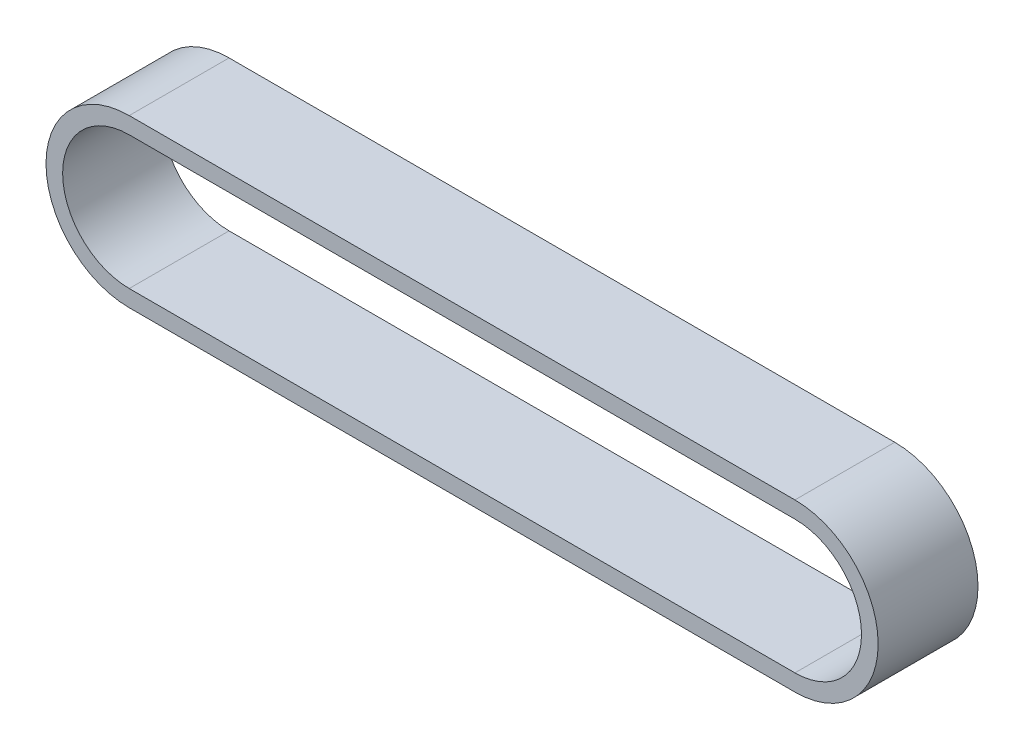
ISO-10303-21;
HEADER;
FILE_DESCRIPTION(('STEP AP214'),'2;1');
FILE_NAME('part.step','',(''),(''),'','','');
FILE_SCHEMA(('AUTOMOTIVE_DESIGN { 1 0 10303 214 1 1 1 1 }'));
ENDSEC;
DATA;
#1=APPLICATION_CONTEXT('core data for automotive mechanical design processes');
#2=APPLICATION_PROTOCOL_DEFINITION('international standard','automotive_design',2000,#1);
#3=PRODUCT_CONTEXT('',#1,'mechanical');
#4=PRODUCT('Part','Part','',(#3));
#5=PRODUCT_RELATED_PRODUCT_CATEGORY('part','',(#4));
#6=PRODUCT_DEFINITION_FORMATION('','',#4);
#7=PRODUCT_DEFINITION_CONTEXT('part definition',#1,'design');
#8=PRODUCT_DEFINITION('design','',#6,#7);
#9=PRODUCT_DEFINITION_SHAPE('','',#8);
#10=(LENGTH_UNIT() NAMED_UNIT(*) SI_UNIT(.MILLI.,.METRE.));
#11=(NAMED_UNIT(*) PLANE_ANGLE_UNIT() SI_UNIT($,.RADIAN.));
#12=(NAMED_UNIT(*) SI_UNIT($,.STERADIAN.) SOLID_ANGLE_UNIT());
#13=UNCERTAINTY_MEASURE_WITH_UNIT(LENGTH_MEASURE(1.E-05),#10,'distance_accuracy_value','');
#14=(GEOMETRIC_REPRESENTATION_CONTEXT(3) GLOBAL_UNCERTAINTY_ASSIGNED_CONTEXT((#13)) GLOBAL_UNIT_ASSIGNED_CONTEXT((#10,
#11,#12)) REPRESENTATION_CONTEXT('',''));
#15=CARTESIAN_POINT('',(0.,0.,0.));
#16=DIRECTION('',(0.,0.,1.));
#17=DIRECTION('',(1.,0.,0.));
#18=AXIS2_PLACEMENT_3D('',#15,#16,#17);
#19=CARTESIAN_POINT('',(0.588618423098236,58.840344830129,15.24));
#20=DIRECTION('',(0.,0.,1.));
#21=DIRECTION('',(1.,0.,0.));
#22=AXIS2_PLACEMENT_3D('',#19,#20,#21);
#23=PLANE('',#22);
#24=CARTESIAN_POINT('',(0.588618423098236,58.840344830129,15.24));
#25=DIRECTION('',(0.,0.,1.));
#26=DIRECTION('',(1.,0.,0.));
#27=AXIS2_PLACEMENT_3D('',#24,#25,#26);
#28=CIRCLE('',#27,12.7);
#29=CARTESIAN_POINT('',(0.588618423098236,71.540344830129,15.24));
#30=VERTEX_POINT('',#29);
#31=CARTESIAN_POINT('',(0.588618423098236,46.140344830129,15.24));
#32=VERTEX_POINT('',#31);
#33=EDGE_CURVE('E133',#30,#32,#28,.T.);
#34=ORIENTED_EDGE('',*,*,#33,.T.);
#35=DIRECTION('',(1.,0.,0.));
#36=VECTOR('',#35,1.);
#37=CARTESIAN_POINT('',(0.588618423098236,46.140344830129,15.24));
#38=LINE('',#37,#36);
#39=CARTESIAN_POINT('',(102.188618423098,46.140344830129,15.24));
#40=VERTEX_POINT('',#39);
#41=EDGE_CURVE('E136',#32,#40,#38,.T.);
#42=ORIENTED_EDGE('',*,*,#41,.T.);
#43=CARTESIAN_POINT('',(102.188618423098,58.840344830129,15.24));
#44=DIRECTION('',(0.,0.,1.));
#45=DIRECTION('',(1.,0.,0.));
#46=AXIS2_PLACEMENT_3D('',#43,#44,#45);
#47=CIRCLE('',#46,12.7);
#48=CARTESIAN_POINT('',(102.188618423098,71.540344830129,15.24));
#49=VERTEX_POINT('',#48);
#50=EDGE_CURVE('E139',#40,#49,#47,.T.);
#51=ORIENTED_EDGE('',*,*,#50,.T.);
#52=DIRECTION('',(-1.,0.,0.));
#53=VECTOR('',#52,1.);
#54=CARTESIAN_POINT('',(0.588618423098236,71.540344830129,15.24));
#55=LINE('',#54,#53);
#56=EDGE_CURVE('E141',#49,#30,#55,.T.);
#57=ORIENTED_EDGE('',*,*,#56,.T.);
#58=EDGE_LOOP('',(#34,#42,#51,#57));
#59=FACE_BOUND('',#58,.T.);
#60=DIRECTION('',(1.,0.,0.));
#61=VECTOR('',#60,1.);
#62=CARTESIAN_POINT('',(0.588618423098236,48.680344830129,15.24));
#63=LINE('',#62,#61);
#64=CARTESIAN_POINT('',(0.588618423098236,48.680344830129,15.24));
#65=VERTEX_POINT('',#64);
#66=CARTESIAN_POINT('',(102.188618423098,48.680344830129,15.24));
#67=VERTEX_POINT('',#66);
#68=EDGE_CURVE('E105',#65,#67,#63,.T.);
#69=ORIENTED_EDGE('',*,*,#68,.F.);
#70=CARTESIAN_POINT('',(0.588618423098236,58.840344830129,15.24));
#71=DIRECTION('',(0.,0.,1.));
#72=DIRECTION('',(1.,0.,0.));
#73=AXIS2_PLACEMENT_3D('',#70,#71,#72);
#74=CIRCLE('',#73,10.16);
#75=CARTESIAN_POINT('',(0.588618423098236,69.000344830129,15.24));
#76=VERTEX_POINT('',#75);
#77=EDGE_CURVE('E97',#76,#65,#74,.T.);
#78=ORIENTED_EDGE('',*,*,#77,.F.);
#79=DIRECTION('',(-1.,0.,0.));
#80=VECTOR('',#79,1.);
#81=CARTESIAN_POINT('',(0.588618423098236,69.000344830129,15.24));
#82=LINE('',#81,#80);
#83=CARTESIAN_POINT('',(102.188618423098,69.000344830129,15.24));
#84=VERTEX_POINT('',#83);
#85=EDGE_CURVE('E119',#84,#76,#82,.T.);
#86=ORIENTED_EDGE('',*,*,#85,.F.);
#87=CARTESIAN_POINT('',(102.188618423098,58.840344830129,15.24));
#88=DIRECTION('',(0.,0.,1.));
#89=DIRECTION('',(1.,0.,0.));
#90=AXIS2_PLACEMENT_3D('',#87,#88,#89);
#91=CIRCLE('',#90,10.16);
#92=EDGE_CURVE('E117',#67,#84,#91,.T.);
#93=ORIENTED_EDGE('',*,*,#92,.F.);
#94=EDGE_LOOP('',(#69,#78,#86,#93));
#95=FACE_BOUND('',#94,.T.);
#96=ADVANCED_FACE('F32',(#59,#95),#23,.T.);
#97=CARTESIAN_POINT('',(0.588618423098236,58.840344830129,0.));
#98=DIRECTION('',(0.,0.,1.));
#99=DIRECTION('',(1.,0.,0.));
#100=AXIS2_PLACEMENT_3D('',#97,#98,#99);
#101=PLANE('',#100);
#102=CARTESIAN_POINT('',(0.588618423098236,58.840344830129,0.));
#103=DIRECTION('',(0.,0.,1.));
#104=DIRECTION('',(1.,0.,0.));
#105=AXIS2_PLACEMENT_3D('',#102,#103,#104);
#106=CIRCLE('',#105,12.7);
#107=CARTESIAN_POINT('',(0.588618423098236,71.540344830129,0.));
#108=VERTEX_POINT('',#107);
#109=CARTESIAN_POINT('',(0.588618423098236,46.140344830129,0.));
#110=VERTEX_POINT('',#109);
#111=EDGE_CURVE('E113',#108,#110,#106,.T.);
#112=ORIENTED_EDGE('',*,*,#111,.F.);
#113=DIRECTION('',(-1.,0.,0.));
#114=VECTOR('',#113,1.);
#115=CARTESIAN_POINT('',(0.588618423098236,71.540344830129,0.));
#116=LINE('',#115,#114);
#117=CARTESIAN_POINT('',(102.188618423098,71.540344830129,0.));
#118=VERTEX_POINT('',#117);
#119=EDGE_CURVE('E137',#118,#108,#116,.T.);
#120=ORIENTED_EDGE('',*,*,#119,.F.);
#121=CARTESIAN_POINT('',(102.188618423098,58.840344830129,0.));
#122=DIRECTION('',(0.,0.,1.));
#123=DIRECTION('',(1.,0.,0.));
#124=AXIS2_PLACEMENT_3D('',#121,#122,#123);
#125=CIRCLE('',#124,12.7);
#126=CARTESIAN_POINT('',(102.188618423098,46.140344830129,0.));
#127=VERTEX_POINT('',#126);
#128=EDGE_CURVE('E148',#127,#118,#125,.T.);
#129=ORIENTED_EDGE('',*,*,#128,.F.);
#130=DIRECTION('',(1.,0.,0.));
#131=VECTOR('',#130,1.);
#132=CARTESIAN_POINT('',(0.588618423098236,46.140344830129,0.));
#133=LINE('',#132,#131);
#134=EDGE_CURVE('E146',#110,#127,#133,.T.);
#135=ORIENTED_EDGE('',*,*,#134,.F.);
#136=EDGE_LOOP('',(#112,#120,#129,#135));
#137=FACE_BOUND('',#136,.T.);
#138=CARTESIAN_POINT('',(0.588618423098236,58.840344830129,0.));
#139=DIRECTION('',(0.,0.,1.));
#140=DIRECTION('',(1.,0.,0.));
#141=AXIS2_PLACEMENT_3D('',#138,#139,#140);
#142=CIRCLE('',#141,10.16);
#143=CARTESIAN_POINT('',(0.588618423098236,69.000344830129,0.));
#144=VERTEX_POINT('',#143);
#145=CARTESIAN_POINT('',(0.588618423098236,48.680344830129,0.));
#146=VERTEX_POINT('',#145);
#147=EDGE_CURVE('E55',#144,#146,#142,.T.);
#148=ORIENTED_EDGE('',*,*,#147,.T.);
#149=DIRECTION('',(1.,0.,0.));
#150=VECTOR('',#149,1.);
#151=CARTESIAN_POINT('',(0.588618423098236,48.680344830129,0.));
#152=LINE('',#151,#150);
#153=CARTESIAN_POINT('',(102.188618423098,48.680344830129,0.));
#154=VERTEX_POINT('',#153);
#155=EDGE_CURVE('E112',#146,#154,#152,.T.);
#156=ORIENTED_EDGE('',*,*,#155,.T.);
#157=CARTESIAN_POINT('',(102.188618423098,58.840344830129,0.));
#158=DIRECTION('',(0.,0.,1.));
#159=DIRECTION('',(1.,0.,0.));
#160=AXIS2_PLACEMENT_3D('',#157,#158,#159);
#161=CIRCLE('',#160,10.16);
#162=CARTESIAN_POINT('',(102.188618423098,69.000344830129,0.));
#163=VERTEX_POINT('',#162);
#164=EDGE_CURVE('E125',#154,#163,#161,.T.);
#165=ORIENTED_EDGE('',*,*,#164,.T.);
#166=DIRECTION('',(-1.,0.,0.));
#167=VECTOR('',#166,1.);
#168=CARTESIAN_POINT('',(0.588618423098236,69.000344830129,0.));
#169=LINE('',#168,#167);
#170=EDGE_CURVE('E106',#163,#144,#169,.T.);
#171=ORIENTED_EDGE('',*,*,#170,.T.);
#172=EDGE_LOOP('',(#148,#156,#165,#171));
#173=FACE_BOUND('',#172,.T.);
#174=ADVANCED_FACE('F166',(#137,#173),#101,.F.);
#175=CARTESIAN_POINT('',(0.588618423098236,58.840344830129,15.24));
#176=DIRECTION('',(0.,0.,-1.));
#177=DIRECTION('',(-1.,0.,0.));
#178=AXIS2_PLACEMENT_3D('',#175,#176,#177);
#179=CYLINDRICAL_SURFACE('',#178,12.7);
#180=ORIENTED_EDGE('',*,*,#111,.T.);
#181=DIRECTION('',(0.,0.,-1.));
#182=VECTOR('',#181,1.);
#183=CARTESIAN_POINT('',(0.588618423098236,46.140344830129,15.24));
#184=LINE('',#183,#182);
#185=EDGE_CURVE('E11',#32,#110,#184,.T.);
#186=ORIENTED_EDGE('',*,*,#185,.F.);
#187=ORIENTED_EDGE('',*,*,#33,.F.);
#188=DIRECTION('',(0.,0.,-1.));
#189=VECTOR('',#188,1.);
#190=CARTESIAN_POINT('',(0.588618423098236,71.540344830129,15.24));
#191=LINE('',#190,#189);
#192=EDGE_CURVE('E143',#30,#108,#191,.T.);
#193=ORIENTED_EDGE('',*,*,#192,.T.);
#194=EDGE_LOOP('',(#180,#186,#187,#193));
#195=FACE_BOUND('',#194,.T.);
#196=ADVANCED_FACE('F34',(#195),#179,.T.);
#197=CARTESIAN_POINT('',(0.588618423098236,46.140344830129,15.24));
#198=DIRECTION('',(0.,1.,0.));
#199=DIRECTION('',(0.,0.,1.));
#200=AXIS2_PLACEMENT_3D('',#197,#198,#199);
#201=PLANE('',#200);
#202=ORIENTED_EDGE('',*,*,#134,.T.);
#203=DIRECTION('',(0.,0.,-1.));
#204=VECTOR('',#203,1.);
#205=CARTESIAN_POINT('',(102.188618423098,46.140344830129,15.24));
#206=LINE('',#205,#204);
#207=EDGE_CURVE('E40',#40,#127,#206,.T.);
#208=ORIENTED_EDGE('',*,*,#207,.F.);
#209=ORIENTED_EDGE('',*,*,#41,.F.);
#210=ORIENTED_EDGE('',*,*,#185,.T.);
#211=EDGE_LOOP('',(#202,#208,#209,#210));
#212=FACE_BOUND('',#211,.T.);
#213=ADVANCED_FACE('F176',(#212),#201,.F.);
#214=CARTESIAN_POINT('',(102.188618423098,58.840344830129,15.24));
#215=DIRECTION('',(0.,0.,-1.));
#216=DIRECTION('',(-1.,0.,0.));
#217=AXIS2_PLACEMENT_3D('',#214,#215,#216);
#218=CYLINDRICAL_SURFACE('',#217,12.7);
#219=ORIENTED_EDGE('',*,*,#128,.T.);
#220=DIRECTION('',(0.,0.,-1.));
#221=VECTOR('',#220,1.);
#222=CARTESIAN_POINT('',(102.188618423098,71.540344830129,15.24));
#223=LINE('',#222,#221);
#224=EDGE_CURVE('E153',#49,#118,#223,.T.);
#225=ORIENTED_EDGE('',*,*,#224,.F.);
#226=ORIENTED_EDGE('',*,*,#50,.F.);
#227=ORIENTED_EDGE('',*,*,#207,.T.);
#228=EDGE_LOOP('',(#219,#225,#226,#227));
#229=FACE_BOUND('',#228,.T.);
#230=ADVANCED_FACE('F160',(#229),#218,.T.);
#231=CARTESIAN_POINT('',(0.588618423098236,71.540344830129,15.24));
#232=DIRECTION('',(0.,-1.,0.));
#233=DIRECTION('',(0.,0.,-1.));
#234=AXIS2_PLACEMENT_3D('',#231,#232,#233);
#235=PLANE('',#234);
#236=ORIENTED_EDGE('',*,*,#119,.T.);
#237=ORIENTED_EDGE('',*,*,#192,.F.);
#238=ORIENTED_EDGE('',*,*,#56,.F.);
#239=ORIENTED_EDGE('',*,*,#224,.T.);
#240=EDGE_LOOP('',(#236,#237,#238,#239));
#241=FACE_BOUND('',#240,.T.);
#242=ADVANCED_FACE('F170',(#241),#235,.F.);
#243=CARTESIAN_POINT('',(0.588618423098236,58.840344830129,15.24));
#244=DIRECTION('',(0.,0.,-1.));
#245=DIRECTION('',(-1.,0.,0.));
#246=AXIS2_PLACEMENT_3D('',#243,#244,#245);
#247=CYLINDRICAL_SURFACE('',#246,10.16);
#248=ORIENTED_EDGE('',*,*,#147,.F.);
#249=DIRECTION('',(0.,0.,-1.));
#250=VECTOR('',#249,1.);
#251=CARTESIAN_POINT('',(0.588618423098236,69.000344830129,15.24));
#252=LINE('',#251,#250);
#253=EDGE_CURVE('E101',#76,#144,#252,.T.);
#254=ORIENTED_EDGE('',*,*,#253,.F.);
#255=ORIENTED_EDGE('',*,*,#77,.T.);
#256=DIRECTION('',(0.,0.,-1.));
#257=VECTOR('',#256,1.);
#258=CARTESIAN_POINT('',(0.588618423098236,48.680344830129,15.24));
#259=LINE('',#258,#257);
#260=EDGE_CURVE('E100',#65,#146,#259,.T.);
#261=ORIENTED_EDGE('',*,*,#260,.T.);
#262=EDGE_LOOP('',(#248,#254,#255,#261));
#263=FACE_BOUND('',#262,.T.);
#264=ADVANCED_FACE('F99',(#263),#247,.F.);
#265=CARTESIAN_POINT('',(0.588618423098236,48.680344830129,15.24));
#266=DIRECTION('',(0.,1.,0.));
#267=DIRECTION('',(0.,0.,1.));
#268=AXIS2_PLACEMENT_3D('',#265,#266,#267);
#269=PLANE('',#268);
#270=ORIENTED_EDGE('',*,*,#155,.F.);
#271=ORIENTED_EDGE('',*,*,#260,.F.);
#272=ORIENTED_EDGE('',*,*,#68,.T.);
#273=DIRECTION('',(0.,0.,-1.));
#274=VECTOR('',#273,1.);
#275=CARTESIAN_POINT('',(102.188618423098,48.680344830129,15.24));
#276=LINE('',#275,#274);
#277=EDGE_CURVE('E114',#67,#154,#276,.T.);
#278=ORIENTED_EDGE('',*,*,#277,.T.);
#279=EDGE_LOOP('',(#270,#271,#272,#278));
#280=FACE_BOUND('',#279,.T.);
#281=ADVANCED_FACE('F109',(#280),#269,.T.);
#282=CARTESIAN_POINT('',(102.188618423098,58.840344830129,15.24));
#283=DIRECTION('',(0.,0.,-1.));
#284=DIRECTION('',(-1.,0.,0.));
#285=AXIS2_PLACEMENT_3D('',#282,#283,#284);
#286=CYLINDRICAL_SURFACE('',#285,10.16);
#287=ORIENTED_EDGE('',*,*,#164,.F.);
#288=ORIENTED_EDGE('',*,*,#277,.F.);
#289=ORIENTED_EDGE('',*,*,#92,.T.);
#290=DIRECTION('',(0.,0.,-1.));
#291=VECTOR('',#290,1.);
#292=CARTESIAN_POINT('',(102.188618423098,69.000344830129,15.24));
#293=LINE('',#292,#291);
#294=EDGE_CURVE('E47',#84,#163,#293,.T.);
#295=ORIENTED_EDGE('',*,*,#294,.T.);
#296=EDGE_LOOP('',(#287,#288,#289,#295));
#297=FACE_BOUND('',#296,.T.);
#298=ADVANCED_FACE('F199',(#297),#286,.F.);
#299=CARTESIAN_POINT('',(0.588618423098236,69.000344830129,15.24));
#300=DIRECTION('',(0.,-1.,0.));
#301=DIRECTION('',(0.,0.,-1.));
#302=AXIS2_PLACEMENT_3D('',#299,#300,#301);
#303=PLANE('',#302);
#304=ORIENTED_EDGE('',*,*,#170,.F.);
#305=ORIENTED_EDGE('',*,*,#294,.F.);
#306=ORIENTED_EDGE('',*,*,#85,.T.);
#307=ORIENTED_EDGE('',*,*,#253,.T.);
#308=EDGE_LOOP('',(#304,#305,#306,#307));
#309=FACE_BOUND('',#308,.T.);
#310=ADVANCED_FACE('F203',(#309),#303,.T.);
#311=CLOSED_SHELL('',(#96,#174,#196,#213,#230,#242,#264,#281,#298,#310));
#312=MANIFOLD_SOLID_BREP('B2',#311);
#313=ADVANCED_BREP_SHAPE_REPRESENTATION('',(#18,#312),#14);
#314=SHAPE_DEFINITION_REPRESENTATION(#9,#313);
ENDSEC;
END-ISO-10303-21;
